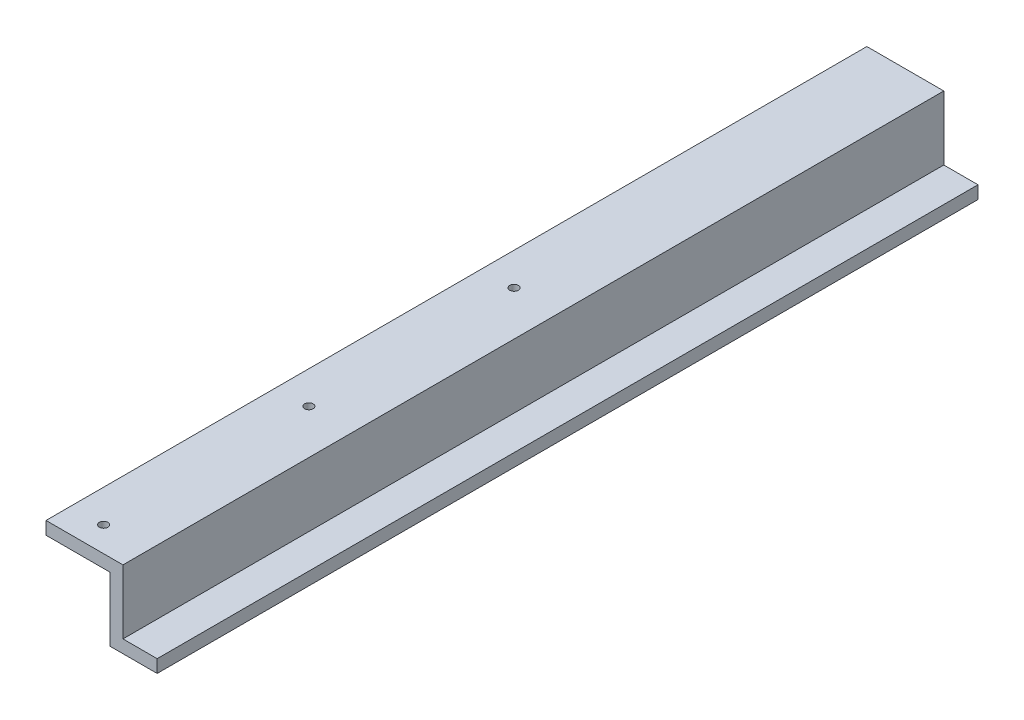
ISO-10303-21;
HEADER;
FILE_DESCRIPTION(('STEP AP214'),'2;1');
FILE_NAME('part.step','',(''),(''),'','','');
FILE_SCHEMA(('AUTOMOTIVE_DESIGN { 1 0 10303 214 1 1 1 1 }'));
ENDSEC;
DATA;
#1=APPLICATION_CONTEXT('core data for automotive mechanical design processes');
#2=APPLICATION_PROTOCOL_DEFINITION('international standard','automotive_design',2000,#1);
#3=PRODUCT_CONTEXT('',#1,'mechanical');
#4=PRODUCT('Part','Part','',(#3));
#5=PRODUCT_RELATED_PRODUCT_CATEGORY('part','',(#4));
#6=PRODUCT_DEFINITION_FORMATION('','',#4);
#7=PRODUCT_DEFINITION_CONTEXT('part definition',#1,'design');
#8=PRODUCT_DEFINITION('design','',#6,#7);
#9=PRODUCT_DEFINITION_SHAPE('','',#8);
#10=(LENGTH_UNIT() NAMED_UNIT(*) SI_UNIT(.MILLI.,.METRE.));
#11=(NAMED_UNIT(*) PLANE_ANGLE_UNIT() SI_UNIT($,.RADIAN.));
#12=(NAMED_UNIT(*) SI_UNIT($,.STERADIAN.) SOLID_ANGLE_UNIT());
#13=UNCERTAINTY_MEASURE_WITH_UNIT(LENGTH_MEASURE(1.E-05),#10,'distance_accuracy_value','');
#14=(GEOMETRIC_REPRESENTATION_CONTEXT(3) GLOBAL_UNCERTAINTY_ASSIGNED_CONTEXT((#13)) GLOBAL_UNIT_ASSIGNED_CONTEXT((#10,
#11,#12)) REPRESENTATION_CONTEXT('',''));
#15=CARTESIAN_POINT('',(0.,0.,0.));
#16=DIRECTION('',(0.,0.,1.));
#17=DIRECTION('',(1.,0.,0.));
#18=AXIS2_PLACEMENT_3D('',#15,#16,#17);
#19=CARTESIAN_POINT('',(2.38125,-9.525,152.4));
#20=DIRECTION('',(0.,-1.,0.));
#21=DIRECTION('',(0.,0.,-1.));
#22=AXIS2_PLACEMENT_3D('',#19,#20,#21);
#23=PLANE('',#22);
#24=DIRECTION('',(0.,0.,-1.));
#25=VECTOR('',#24,1.);
#26=CARTESIAN_POINT('',(15.08125,-9.525,152.4));
#27=LINE('',#26,#25);
#28=CARTESIAN_POINT('',(15.08125,-9.525,152.4));
#29=VERTEX_POINT('',#28);
#30=CARTESIAN_POINT('',(15.08125,-9.525,-152.4));
#31=VERTEX_POINT('',#30);
#32=EDGE_CURVE('E137',#29,#31,#27,.T.);
#33=ORIENTED_EDGE('',*,*,#32,.T.);
#34=DIRECTION('',(-1.,0.,0.));
#35=VECTOR('',#34,1.);
#36=CARTESIAN_POINT('',(2.38125,-9.525,-152.4));
#37=LINE('',#36,#35);
#38=CARTESIAN_POINT('',(2.38125,-9.525,-152.4));
#39=VERTEX_POINT('',#38);
#40=EDGE_CURVE('E131',#31,#39,#37,.T.);
#41=ORIENTED_EDGE('',*,*,#40,.T.);
#42=DIRECTION('',(0.,0.,-1.));
#43=VECTOR('',#42,1.);
#44=CARTESIAN_POINT('',(2.38125,-9.525,152.4));
#45=LINE('',#44,#43);
#46=CARTESIAN_POINT('',(2.38125,-9.525,152.4));
#47=VERTEX_POINT('',#46);
#48=EDGE_CURVE('E12',#47,#39,#45,.T.);
#49=ORIENTED_EDGE('',*,*,#48,.F.);
#50=DIRECTION('',(-1.,0.,0.));
#51=VECTOR('',#50,1.);
#52=CARTESIAN_POINT('',(2.38125,-9.525,152.4));
#53=LINE('',#52,#51);
#54=EDGE_CURVE('E162',#29,#47,#53,.T.);
#55=ORIENTED_EDGE('',*,*,#54,.F.);
#56=EDGE_LOOP('',(#33,#41,#49,#55));
#57=FACE_BOUND('',#56,.T.);
#58=ADVANCED_FACE('F55',(#57),#23,.F.);
#59=CARTESIAN_POINT('',(2.38125,-9.525,152.4));
#60=DIRECTION('',(-1.,0.,0.));
#61=DIRECTION('',(0.,0.,1.));
#62=AXIS2_PLACEMENT_3D('',#59,#60,#61);
#63=PLANE('',#62);
#64=ORIENTED_EDGE('',*,*,#48,.T.);
#65=DIRECTION('',(0.,1.,0.));
#66=VECTOR('',#65,1.);
#67=CARTESIAN_POINT('',(2.38125,-9.525,-152.4));
#68=LINE('',#67,#66);
#69=CARTESIAN_POINT('',(2.38125,14.2875,-152.4));
#70=VERTEX_POINT('',#69);
#71=EDGE_CURVE('E121',#39,#70,#68,.T.);
#72=ORIENTED_EDGE('',*,*,#71,.T.);
#73=DIRECTION('',(0.,0.,-1.));
#74=VECTOR('',#73,1.);
#75=CARTESIAN_POINT('',(2.38125,14.2875,152.4));
#76=LINE('',#75,#74);
#77=CARTESIAN_POINT('',(2.38125,14.2875,152.4));
#78=VERTEX_POINT('',#77);
#79=EDGE_CURVE('E62',#78,#70,#76,.T.);
#80=ORIENTED_EDGE('',*,*,#79,.F.);
#81=DIRECTION('',(0.,1.,0.));
#82=VECTOR('',#81,1.);
#83=CARTESIAN_POINT('',(2.38125,-9.525,152.4));
#84=LINE('',#83,#82);
#85=EDGE_CURVE('E122',#47,#78,#84,.T.);
#86=ORIENTED_EDGE('',*,*,#85,.F.);
#87=EDGE_LOOP('',(#64,#72,#80,#86));
#88=FACE_BOUND('',#87,.T.);
#89=ADVANCED_FACE('F119',(#88),#63,.F.);
#90=CARTESIAN_POINT('',(2.38125,14.2875,152.4));
#91=DIRECTION('',(0.,-1.,0.));
#92=DIRECTION('',(0.,0.,-1.));
#93=AXIS2_PLACEMENT_3D('',#90,#91,#92);
#94=PLANE('',#93);
#95=CARTESIAN_POINT('',(-14.0958028103765,14.2875,143.094207794197));
#96=DIRECTION('',(0.,-1.,0.));
#97=DIRECTION('',(0.,0.,-1.));
#98=AXIS2_PLACEMENT_3D('',#95,#96,#97);
#99=CIRCLE('',#98,1.5875);
#100=CARTESIAN_POINT('',(-14.0958028103765,14.2875,141.506707794197));
#101=VERTEX_POINT('',#100);
#102=EDGE_CURVE('E138',#101,#101,#99,.T.);
#103=ORIENTED_EDGE('',*,*,#102,.T.);
#104=EDGE_LOOP('',(#103));
#105=FACE_BOUND('',#104,.T.);
#106=CARTESIAN_POINT('',(-14.0958028103765,14.2875,66.8942077941967));
#107=DIRECTION('',(0.,-1.,0.));
#108=DIRECTION('',(0.,0.,-1.));
#109=AXIS2_PLACEMENT_3D('',#106,#107,#108);
#110=CIRCLE('',#109,1.5875);
#111=CARTESIAN_POINT('',(-14.0958028103765,14.2875,65.3067077941967));
#112=VERTEX_POINT('',#111);
#113=EDGE_CURVE('E361',#112,#112,#110,.T.);
#114=ORIENTED_EDGE('',*,*,#113,.T.);
#115=EDGE_LOOP('',(#114));
#116=FACE_BOUND('',#115,.T.);
#117=CARTESIAN_POINT('',(-14.0958028103765,14.2875,-9.30579220580333));
#118=DIRECTION('',(0.,-1.,0.));
#119=DIRECTION('',(0.,0.,-1.));
#120=AXIS2_PLACEMENT_3D('',#117,#118,#119);
#121=CIRCLE('',#120,1.5875);
#122=CARTESIAN_POINT('',(-14.0958028103765,14.2875,-10.8932922058033));
#123=VERTEX_POINT('',#122);
#124=EDGE_CURVE('E144',#123,#123,#121,.T.);
#125=ORIENTED_EDGE('',*,*,#124,.T.);
#126=EDGE_LOOP('',(#125));
#127=FACE_BOUND('',#126,.T.);
#128=ORIENTED_EDGE('',*,*,#79,.T.);
#129=DIRECTION('',(-1.,0.,0.));
#130=VECTOR('',#129,1.);
#131=CARTESIAN_POINT('',(2.38125,14.2875,-152.4));
#132=LINE('',#131,#130);
#133=CARTESIAN_POINT('',(-26.19375,14.2875,-152.4));
#134=VERTEX_POINT('',#133);
#135=EDGE_CURVE('E135',#70,#134,#132,.T.);
#136=ORIENTED_EDGE('',*,*,#135,.T.);
#137=DIRECTION('',(0.,0.,-1.));
#138=VECTOR('',#137,1.);
#139=CARTESIAN_POINT('',(-26.19375,14.2875,152.4));
#140=LINE('',#139,#138);
#141=CARTESIAN_POINT('',(-26.19375,14.2875,152.4));
#142=VERTEX_POINT('',#141);
#143=EDGE_CURVE('E184',#142,#134,#140,.T.);
#144=ORIENTED_EDGE('',*,*,#143,.F.);
#145=DIRECTION('',(-1.,0.,0.));
#146=VECTOR('',#145,1.);
#147=CARTESIAN_POINT('',(2.38125,14.2875,152.4));
#148=LINE('',#147,#146);
#149=EDGE_CURVE('E165',#78,#142,#148,.T.);
#150=ORIENTED_EDGE('',*,*,#149,.F.);
#151=EDGE_LOOP('',(#128,#136,#144,#150));
#152=FACE_BOUND('',#151,.T.);
#153=ADVANCED_FACE('F187',(#105,#116,#127,#152),#94,.F.);
#154=CARTESIAN_POINT('',(-26.19375,14.2875,152.4));
#155=DIRECTION('',(1.,0.,0.));
#156=DIRECTION('',(0.,0.,-1.));
#157=AXIS2_PLACEMENT_3D('',#154,#155,#156);
#158=PLANE('',#157);
#159=ORIENTED_EDGE('',*,*,#143,.T.);
#160=DIRECTION('',(0.,-1.,0.));
#161=VECTOR('',#160,1.);
#162=CARTESIAN_POINT('',(-26.19375,14.2875,-152.4));
#163=LINE('',#162,#161);
#164=CARTESIAN_POINT('',(-26.19375,9.525,-152.4));
#165=VERTEX_POINT('',#164);
#166=EDGE_CURVE('E148',#134,#165,#163,.T.);
#167=ORIENTED_EDGE('',*,*,#166,.T.);
#168=DIRECTION('',(0.,0.,-1.));
#169=VECTOR('',#168,1.);
#170=CARTESIAN_POINT('',(-26.19375,9.525,152.4));
#171=LINE('',#170,#169);
#172=CARTESIAN_POINT('',(-26.19375,9.525,152.4));
#173=VERTEX_POINT('',#172);
#174=EDGE_CURVE('E182',#173,#165,#171,.T.);
#175=ORIENTED_EDGE('',*,*,#174,.F.);
#176=DIRECTION('',(0.,-1.,0.));
#177=VECTOR('',#176,1.);
#178=CARTESIAN_POINT('',(-26.19375,14.2875,152.4));
#179=LINE('',#178,#177);
#180=EDGE_CURVE('E167',#142,#173,#179,.T.);
#181=ORIENTED_EDGE('',*,*,#180,.F.);
#182=EDGE_LOOP('',(#159,#167,#175,#181));
#183=FACE_BOUND('',#182,.T.);
#184=ADVANCED_FACE('F195',(#183),#158,.F.);
#185=CARTESIAN_POINT('',(-2.38125,9.525,152.4));
#186=DIRECTION('',(0.,1.,0.));
#187=DIRECTION('',(0.,0.,1.));
#188=AXIS2_PLACEMENT_3D('',#185,#186,#187);
#189=PLANE('',#188);
#190=CARTESIAN_POINT('',(-14.0958028103765,9.525,143.094207794197));
#191=DIRECTION('',(0.,-1.,0.));
#192=DIRECTION('',(0.,0.,-1.));
#193=AXIS2_PLACEMENT_3D('',#190,#191,#192);
#194=CIRCLE('',#193,1.5875);
#195=CARTESIAN_POINT('',(-14.0958028103765,9.525,141.506707794197));
#196=VERTEX_POINT('',#195);
#197=EDGE_CURVE('E141',#196,#196,#194,.T.);
#198=ORIENTED_EDGE('',*,*,#197,.F.);
#199=EDGE_LOOP('',(#198));
#200=FACE_BOUND('',#199,.T.);
#201=CARTESIAN_POINT('',(-14.0958028103765,9.525,66.8942077941967));
#202=DIRECTION('',(0.,-1.,0.));
#203=DIRECTION('',(0.,0.,-1.));
#204=AXIS2_PLACEMENT_3D('',#201,#202,#203);
#205=CIRCLE('',#204,1.5875);
#206=CARTESIAN_POINT('',(-14.0958028103765,9.525,65.3067077941967));
#207=VERTEX_POINT('',#206);
#208=EDGE_CURVE('E358',#207,#207,#205,.T.);
#209=ORIENTED_EDGE('',*,*,#208,.F.);
#210=EDGE_LOOP('',(#209));
#211=FACE_BOUND('',#210,.T.);
#212=CARTESIAN_POINT('',(-14.0958028103765,9.525,-9.30579220580333));
#213=DIRECTION('',(0.,-1.,0.));
#214=DIRECTION('',(0.,0.,-1.));
#215=AXIS2_PLACEMENT_3D('',#212,#213,#214);
#216=CIRCLE('',#215,1.5875);
#217=CARTESIAN_POINT('',(-14.0958028103765,9.525,-10.8932922058033));
#218=VERTEX_POINT('',#217);
#219=EDGE_CURVE('E365',#218,#218,#216,.T.);
#220=ORIENTED_EDGE('',*,*,#219,.F.);
#221=EDGE_LOOP('',(#220));
#222=FACE_BOUND('',#221,.T.);
#223=ORIENTED_EDGE('',*,*,#174,.T.);
#224=DIRECTION('',(1.,0.,0.));
#225=VECTOR('',#224,1.);
#226=CARTESIAN_POINT('',(-2.38125,9.525,-152.4));
#227=LINE('',#226,#225);
#228=CARTESIAN_POINT('',(-2.38125,9.525,-152.4));
#229=VERTEX_POINT('',#228);
#230=EDGE_CURVE('E151',#165,#229,#227,.T.);
#231=ORIENTED_EDGE('',*,*,#230,.T.);
#232=DIRECTION('',(0.,0.,-1.));
#233=VECTOR('',#232,1.);
#234=CARTESIAN_POINT('',(-2.38125,9.525,152.4));
#235=LINE('',#234,#233);
#236=CARTESIAN_POINT('',(-2.38125,9.525,152.4));
#237=VERTEX_POINT('',#236);
#238=EDGE_CURVE('E180',#237,#229,#235,.T.);
#239=ORIENTED_EDGE('',*,*,#238,.F.);
#240=DIRECTION('',(1.,0.,0.));
#241=VECTOR('',#240,1.);
#242=CARTESIAN_POINT('',(-2.38125,9.525,152.4));
#243=LINE('',#242,#241);
#244=EDGE_CURVE('E169',#173,#237,#243,.T.);
#245=ORIENTED_EDGE('',*,*,#244,.F.);
#246=EDGE_LOOP('',(#223,#231,#239,#245));
#247=FACE_BOUND('',#246,.T.);
#248=ADVANCED_FACE('F198',(#200,#211,#222,#247),#189,.F.);
#249=CARTESIAN_POINT('',(-2.38125,-14.2875,152.4));
#250=DIRECTION('',(1.,0.,0.));
#251=DIRECTION('',(0.,0.,-1.));
#252=AXIS2_PLACEMENT_3D('',#249,#250,#251);
#253=PLANE('',#252);
#254=ORIENTED_EDGE('',*,*,#238,.T.);
#255=DIRECTION('',(0.,-1.,0.));
#256=VECTOR('',#255,1.);
#257=CARTESIAN_POINT('',(-2.38125,-14.2875,-152.4));
#258=LINE('',#257,#256);
#259=CARTESIAN_POINT('',(-2.38125,-14.2875,-152.4));
#260=VERTEX_POINT('',#259);
#261=EDGE_CURVE('E154',#229,#260,#258,.T.);
#262=ORIENTED_EDGE('',*,*,#261,.T.);
#263=DIRECTION('',(0.,0.,-1.));
#264=VECTOR('',#263,1.);
#265=CARTESIAN_POINT('',(-2.38125,-14.2875,152.4));
#266=LINE('',#265,#264);
#267=CARTESIAN_POINT('',(-2.38125,-14.2875,152.4));
#268=VERTEX_POINT('',#267);
#269=EDGE_CURVE('E178',#268,#260,#266,.T.);
#270=ORIENTED_EDGE('',*,*,#269,.F.);
#271=DIRECTION('',(0.,-1.,0.));
#272=VECTOR('',#271,1.);
#273=CARTESIAN_POINT('',(-2.38125,-14.2875,152.4));
#274=LINE('',#273,#272);
#275=EDGE_CURVE('E171',#237,#268,#274,.T.);
#276=ORIENTED_EDGE('',*,*,#275,.F.);
#277=EDGE_LOOP('',(#254,#262,#270,#276));
#278=FACE_BOUND('',#277,.T.);
#279=ADVANCED_FACE('F203',(#278),#253,.F.);
#280=CARTESIAN_POINT('',(-2.38125,-14.2875,152.4));
#281=DIRECTION('',(0.,1.,0.));
#282=DIRECTION('',(0.,0.,1.));
#283=AXIS2_PLACEMENT_3D('',#280,#281,#282);
#284=PLANE('',#283);
#285=ORIENTED_EDGE('',*,*,#269,.T.);
#286=DIRECTION('',(1.,0.,0.));
#287=VECTOR('',#286,1.);
#288=CARTESIAN_POINT('',(-2.38125,-14.2875,-152.4));
#289=LINE('',#288,#287);
#290=CARTESIAN_POINT('',(15.08125,-14.2875,-152.4));
#291=VERTEX_POINT('',#290);
#292=EDGE_CURVE('E157',#260,#291,#289,.T.);
#293=ORIENTED_EDGE('',*,*,#292,.T.);
#294=DIRECTION('',(0.,0.,-1.));
#295=VECTOR('',#294,1.);
#296=CARTESIAN_POINT('',(15.08125,-14.2875,152.4));
#297=LINE('',#296,#295);
#298=CARTESIAN_POINT('',(15.08125,-14.2875,152.4));
#299=VERTEX_POINT('',#298);
#300=EDGE_CURVE('E176',#299,#291,#297,.T.);
#301=ORIENTED_EDGE('',*,*,#300,.F.);
#302=DIRECTION('',(1.,0.,0.));
#303=VECTOR('',#302,1.);
#304=CARTESIAN_POINT('',(-2.38125,-14.2875,152.4));
#305=LINE('',#304,#303);
#306=EDGE_CURVE('E74',#268,#299,#305,.T.);
#307=ORIENTED_EDGE('',*,*,#306,.F.);
#308=EDGE_LOOP('',(#285,#293,#301,#307));
#309=FACE_BOUND('',#308,.T.);
#310=ADVANCED_FACE('F206',(#309),#284,.F.);
#311=CARTESIAN_POINT('',(15.08125,-9.525,152.4));
#312=DIRECTION('',(-1.,0.,0.));
#313=DIRECTION('',(0.,0.,1.));
#314=AXIS2_PLACEMENT_3D('',#311,#312,#313);
#315=PLANE('',#314);
#316=ORIENTED_EDGE('',*,*,#300,.T.);
#317=DIRECTION('',(0.,1.,0.));
#318=VECTOR('',#317,1.);
#319=CARTESIAN_POINT('',(15.08125,-9.525,-152.4));
#320=LINE('',#319,#318);
#321=EDGE_CURVE('E160',#291,#31,#320,.T.);
#322=ORIENTED_EDGE('',*,*,#321,.T.);
#323=ORIENTED_EDGE('',*,*,#32,.F.);
#324=DIRECTION('',(0.,1.,0.));
#325=VECTOR('',#324,1.);
#326=CARTESIAN_POINT('',(15.08125,-9.525,152.4));
#327=LINE('',#326,#325);
#328=EDGE_CURVE('E69',#299,#29,#327,.T.);
#329=ORIENTED_EDGE('',*,*,#328,.F.);
#330=EDGE_LOOP('',(#316,#322,#323,#329));
#331=FACE_BOUND('',#330,.T.);
#332=ADVANCED_FACE('F208',(#331),#315,.F.);
#333=CARTESIAN_POINT('',(0.,0.,152.4));
#334=DIRECTION('',(0.,0.,-1.));
#335=DIRECTION('',(-1.,0.,0.));
#336=AXIS2_PLACEMENT_3D('',#333,#334,#335);
#337=PLANE('',#336);
#338=ORIENTED_EDGE('',*,*,#54,.T.);
#339=ORIENTED_EDGE('',*,*,#85,.T.);
#340=ORIENTED_EDGE('',*,*,#149,.T.);
#341=ORIENTED_EDGE('',*,*,#180,.T.);
#342=ORIENTED_EDGE('',*,*,#244,.T.);
#343=ORIENTED_EDGE('',*,*,#275,.T.);
#344=ORIENTED_EDGE('',*,*,#306,.T.);
#345=ORIENTED_EDGE('',*,*,#328,.T.);
#346=EDGE_LOOP('',(#338,#339,#340,#341,#342,#343,#344,#345));
#347=FACE_BOUND('',#346,.T.);
#348=ADVANCED_FACE('F190',(#347),#337,.F.);
#349=CARTESIAN_POINT('',(0.,0.,-152.4));
#350=DIRECTION('',(0.,0.,-1.));
#351=DIRECTION('',(-1.,0.,0.));
#352=AXIS2_PLACEMENT_3D('',#349,#350,#351);
#353=PLANE('',#352);
#354=ORIENTED_EDGE('',*,*,#40,.F.);
#355=ORIENTED_EDGE('',*,*,#321,.F.);
#356=ORIENTED_EDGE('',*,*,#292,.F.);
#357=ORIENTED_EDGE('',*,*,#261,.F.);
#358=ORIENTED_EDGE('',*,*,#230,.F.);
#359=ORIENTED_EDGE('',*,*,#166,.F.);
#360=ORIENTED_EDGE('',*,*,#135,.F.);
#361=ORIENTED_EDGE('',*,*,#71,.F.);
#362=EDGE_LOOP('',(#354,#355,#356,#357,#358,#359,#360,#361));
#363=FACE_BOUND('',#362,.T.);
#364=ADVANCED_FACE('F129',(#363),#353,.T.);
#365=CARTESIAN_POINT('',(-14.0958028103765,14.2875,-9.30579220580333));
#366=DIRECTION('',(0.,-1.,0.));
#367=DIRECTION('',(0.,0.,-1.));
#368=AXIS2_PLACEMENT_3D('',#365,#366,#367);
#369=CYLINDRICAL_SURFACE('',#368,1.5875);
#370=CARTESIAN_POINT('',(-14.0958028103765,14.2875,-10.8932922058033));
#371=CARTESIAN_POINT('',(-14.0958028103765,14.237890625,-10.8932922058033));
#372=CARTESIAN_POINT('',(-14.0958028103765,14.18828125,-10.8932922058033));
#373=CARTESIAN_POINT('',(-14.0958028103765,14.0890625,-10.8932922058033));
#374=CARTESIAN_POINT('',(-14.0958028103765,14.039453125,-10.8932922058033));
#375=CARTESIAN_POINT('',(-14.0958028103765,13.940234375,-10.8932922058033));
#376=CARTESIAN_POINT('',(-14.0958028103765,13.890625,-10.8932922058033));
#377=CARTESIAN_POINT('',(-14.0958028103765,13.79140625,-10.8932922058033));
#378=CARTESIAN_POINT('',(-14.0958028103765,13.741796875,-10.8932922058033));
#379=CARTESIAN_POINT('',(-14.0958028103765,13.642578125,-10.8932922058033));
#380=CARTESIAN_POINT('',(-14.0958028103765,13.59296875,-10.8932922058033));
#381=CARTESIAN_POINT('',(-14.0958028103765,13.49375,-10.8932922058033));
#382=CARTESIAN_POINT('',(-14.0958028103765,13.444140625,-10.8932922058033));
#383=CARTESIAN_POINT('',(-14.0958028103765,13.344921875,-10.8932922058033));
#384=CARTESIAN_POINT('',(-14.0958028103765,13.2953125,-10.8932922058033));
#385=CARTESIAN_POINT('',(-14.0958028103765,13.19609375,-10.8932922058033));
#386=CARTESIAN_POINT('',(-14.0958028103765,13.146484375,-10.8932922058033));
#387=CARTESIAN_POINT('',(-14.0958028103765,13.047265625,-10.8932922058033));
#388=CARTESIAN_POINT('',(-14.0958028103765,12.99765625,-10.8932922058033));
#389=CARTESIAN_POINT('',(-14.0958028103765,12.8984375,-10.8932922058033));
#390=CARTESIAN_POINT('',(-14.0958028103765,12.848828125,-10.8932922058033));
#391=CARTESIAN_POINT('',(-14.0958028103765,12.749609375,-10.8932922058033));
#392=CARTESIAN_POINT('',(-14.0958028103765,12.7,-10.8932922058033));
#393=CARTESIAN_POINT('',(-14.0958028103765,12.60078125,-10.8932922058033));
#394=CARTESIAN_POINT('',(-14.0958028103765,12.551171875,-10.8932922058033));
#395=CARTESIAN_POINT('',(-14.0958028103765,12.451953125,-10.8932922058033));
#396=CARTESIAN_POINT('',(-14.0958028103765,12.40234375,-10.8932922058033));
#397=CARTESIAN_POINT('',(-14.0958028103765,12.303125,-10.8932922058033));
#398=CARTESIAN_POINT('',(-14.0958028103765,12.253515625,-10.8932922058033));
#399=CARTESIAN_POINT('',(-14.0958028103765,12.154296875,-10.8932922058033));
#400=CARTESIAN_POINT('',(-14.0958028103765,12.1046875,-10.8932922058033));
#401=CARTESIAN_POINT('',(-14.0958028103765,12.00546875,-10.8932922058033));
#402=CARTESIAN_POINT('',(-14.0958028103765,11.955859375,-10.8932922058033));
#403=CARTESIAN_POINT('',(-14.0958028103765,11.856640625,-10.8932922058033));
#404=CARTESIAN_POINT('',(-14.0958028103765,11.80703125,-10.8932922058033));
#405=CARTESIAN_POINT('',(-14.0958028103765,11.7078125,-10.8932922058033));
#406=CARTESIAN_POINT('',(-14.0958028103765,11.658203125,-10.8932922058033));
#407=CARTESIAN_POINT('',(-14.0958028103765,11.558984375,-10.8932922058033));
#408=CARTESIAN_POINT('',(-14.0958028103765,11.509375,-10.8932922058033));
#409=CARTESIAN_POINT('',(-14.0958028103765,11.41015625,-10.8932922058033));
#410=CARTESIAN_POINT('',(-14.0958028103765,11.360546875,-10.8932922058033));
#411=CARTESIAN_POINT('',(-14.0958028103765,11.261328125,-10.8932922058033));
#412=CARTESIAN_POINT('',(-14.0958028103765,11.21171875,-10.8932922058033));
#413=CARTESIAN_POINT('',(-14.0958028103765,11.1125,-10.8932922058033));
#414=CARTESIAN_POINT('',(-14.0958028103765,11.062890625,-10.8932922058033));
#415=CARTESIAN_POINT('',(-14.0958028103765,10.963671875,-10.8932922058033));
#416=CARTESIAN_POINT('',(-14.0958028103765,10.9140625,-10.8932922058033));
#417=CARTESIAN_POINT('',(-14.0958028103765,10.81484375,-10.8932922058033));
#418=CARTESIAN_POINT('',(-14.0958028103765,10.765234375,-10.8932922058033));
#419=CARTESIAN_POINT('',(-14.0958028103765,10.666015625,-10.8932922058033));
#420=CARTESIAN_POINT('',(-14.0958028103765,10.61640625,-10.8932922058033));
#421=CARTESIAN_POINT('',(-14.0958028103765,10.5171875,-10.8932922058033));
#422=CARTESIAN_POINT('',(-14.0958028103765,10.467578125,-10.8932922058033));
#423=CARTESIAN_POINT('',(-14.0958028103765,10.368359375,-10.8932922058033));
#424=CARTESIAN_POINT('',(-14.0958028103765,10.31875,-10.8932922058033));
#425=CARTESIAN_POINT('',(-14.0958028103765,10.21953125,-10.8932922058033));
#426=CARTESIAN_POINT('',(-14.0958028103765,10.169921875,-10.8932922058033));
#427=CARTESIAN_POINT('',(-14.0958028103765,10.070703125,-10.8932922058033));
#428=CARTESIAN_POINT('',(-14.0958028103765,10.02109375,-10.8932922058033));
#429=CARTESIAN_POINT('',(-14.0958028103765,9.921875,-10.8932922058033));
#430=CARTESIAN_POINT('',(-14.0958028103765,9.872265625,-10.8932922058033));
#431=CARTESIAN_POINT('',(-14.0958028103765,9.773046875,-10.8932922058033));
#432=CARTESIAN_POINT('',(-14.0958028103765,9.7234375,-10.8932922058033));
#433=CARTESIAN_POINT('',(-14.0958028103765,9.62421875,-10.8932922058033));
#434=CARTESIAN_POINT('',(-14.0958028103765,9.574609375,-10.8932922058033));
#435=CARTESIAN_POINT('',(-14.0958028103765,9.525,-10.8932922058033));
#436=B_SPLINE_CURVE_WITH_KNOTS('',3,(#370,#371,#372,#373,#374,#375,#376,#377,#378,#379,#380,
#381,#382,#383,#384,#385,#386,#387,#388,#389,#390,#391,#392,#393,#394,#395,#396,#397,#398,#399,
#400,#401,#402,#403,#404,#405,#406,#407,#408,#409,#410,#411,#412,#413,#414,#415,#416,#417,#418,
#419,#420,#421,#422,#423,#424,#425,#426,#427,#428,#429,#430,#431,#432,#433,#434,#435),
.UNSPECIFIED.,.F.,.F.,(4,2,2,2,2,2,2,2,2,2,2,2,2,2,2,2,2,2,2,2,2,2,2,2,2,2,2,2,2,2,2,2,4),(0.,
0.148828124999998,0.297656249999998,0.446484374999999,0.595312499999999,0.744140624999999,
0.892968749999999,1.041796875,1.190625,1.339453125,1.48828125,1.637109375,1.7859375,1.934765625,
2.08359375,2.232421875,2.38125,2.530078125,2.67890625,2.827734375,2.9765625,3.125390625,
3.27421875,3.423046875,3.571875,3.720703125,3.86953125,4.018359375,4.1671875,4.316015625,
4.46484375,4.613671875,4.7625),.UNSPECIFIED.);
#437=EDGE_CURVE('BSEAM266',#123,#218,#436,.T.);
#438=ORIENTED_EDGE('',*,*,#124,.F.);
#439=ORIENTED_EDGE('',*,*,#219,.T.);
#440=ORIENTED_EDGE('',*,*,#437,.T.);
#441=ORIENTED_EDGE('',*,*,#437,.F.);
#442=EDGE_LOOP('',(#438,#440,#439,#441));
#443=FACE_BOUND('',#442,.T.);
#444=ADVANCED_FACE('F266',(#443),#369,.F.);
#445=CARTESIAN_POINT('',(-14.0958028103765,14.2875,66.8942077941967));
#446=DIRECTION('',(0.,-1.,0.));
#447=DIRECTION('',(0.,0.,-1.));
#448=AXIS2_PLACEMENT_3D('',#445,#446,#447);
#449=CYLINDRICAL_SURFACE('',#448,1.5875);
#450=CARTESIAN_POINT('',(-14.0958028103765,14.2875,65.3067077941967));
#451=CARTESIAN_POINT('',(-14.0958028103765,14.237890625,65.3067077941967));
#452=CARTESIAN_POINT('',(-14.0958028103765,14.18828125,65.3067077941967));
#453=CARTESIAN_POINT('',(-14.0958028103765,14.0890625,65.3067077941967));
#454=CARTESIAN_POINT('',(-14.0958028103765,14.039453125,65.3067077941967));
#455=CARTESIAN_POINT('',(-14.0958028103765,13.940234375,65.3067077941967));
#456=CARTESIAN_POINT('',(-14.0958028103765,13.890625,65.3067077941967));
#457=CARTESIAN_POINT('',(-14.0958028103765,13.79140625,65.3067077941967));
#458=CARTESIAN_POINT('',(-14.0958028103765,13.741796875,65.3067077941967));
#459=CARTESIAN_POINT('',(-14.0958028103765,13.642578125,65.3067077941967));
#460=CARTESIAN_POINT('',(-14.0958028103765,13.59296875,65.3067077941967));
#461=CARTESIAN_POINT('',(-14.0958028103765,13.49375,65.3067077941967));
#462=CARTESIAN_POINT('',(-14.0958028103765,13.444140625,65.3067077941967));
#463=CARTESIAN_POINT('',(-14.0958028103765,13.344921875,65.3067077941967));
#464=CARTESIAN_POINT('',(-14.0958028103765,13.2953125,65.3067077941967));
#465=CARTESIAN_POINT('',(-14.0958028103765,13.19609375,65.3067077941967));
#466=CARTESIAN_POINT('',(-14.0958028103765,13.146484375,65.3067077941967));
#467=CARTESIAN_POINT('',(-14.0958028103765,13.047265625,65.3067077941967));
#468=CARTESIAN_POINT('',(-14.0958028103765,12.99765625,65.3067077941967));
#469=CARTESIAN_POINT('',(-14.0958028103765,12.8984375,65.3067077941967));
#470=CARTESIAN_POINT('',(-14.0958028103765,12.848828125,65.3067077941967));
#471=CARTESIAN_POINT('',(-14.0958028103765,12.749609375,65.3067077941967));
#472=CARTESIAN_POINT('',(-14.0958028103765,12.7,65.3067077941967));
#473=CARTESIAN_POINT('',(-14.0958028103765,12.60078125,65.3067077941967));
#474=CARTESIAN_POINT('',(-14.0958028103765,12.551171875,65.3067077941967));
#475=CARTESIAN_POINT('',(-14.0958028103765,12.451953125,65.3067077941967));
#476=CARTESIAN_POINT('',(-14.0958028103765,12.40234375,65.3067077941967));
#477=CARTESIAN_POINT('',(-14.0958028103765,12.303125,65.3067077941967));
#478=CARTESIAN_POINT('',(-14.0958028103765,12.253515625,65.3067077941967));
#479=CARTESIAN_POINT('',(-14.0958028103765,12.154296875,65.3067077941967));
#480=CARTESIAN_POINT('',(-14.0958028103765,12.1046875,65.3067077941967));
#481=CARTESIAN_POINT('',(-14.0958028103765,12.00546875,65.3067077941967));
#482=CARTESIAN_POINT('',(-14.0958028103765,11.955859375,65.3067077941967));
#483=CARTESIAN_POINT('',(-14.0958028103765,11.856640625,65.3067077941967));
#484=CARTESIAN_POINT('',(-14.0958028103765,11.80703125,65.3067077941967));
#485=CARTESIAN_POINT('',(-14.0958028103765,11.7078125,65.3067077941967));
#486=CARTESIAN_POINT('',(-14.0958028103765,11.658203125,65.3067077941967));
#487=CARTESIAN_POINT('',(-14.0958028103765,11.558984375,65.3067077941967));
#488=CARTESIAN_POINT('',(-14.0958028103765,11.509375,65.3067077941967));
#489=CARTESIAN_POINT('',(-14.0958028103765,11.41015625,65.3067077941967));
#490=CARTESIAN_POINT('',(-14.0958028103765,11.360546875,65.3067077941967));
#491=CARTESIAN_POINT('',(-14.0958028103765,11.261328125,65.3067077941967));
#492=CARTESIAN_POINT('',(-14.0958028103765,11.21171875,65.3067077941967));
#493=CARTESIAN_POINT('',(-14.0958028103765,11.1125,65.3067077941967));
#494=CARTESIAN_POINT('',(-14.0958028103765,11.062890625,65.3067077941967));
#495=CARTESIAN_POINT('',(-14.0958028103765,10.963671875,65.3067077941967));
#496=CARTESIAN_POINT('',(-14.0958028103765,10.9140625,65.3067077941967));
#497=CARTESIAN_POINT('',(-14.0958028103765,10.81484375,65.3067077941967));
#498=CARTESIAN_POINT('',(-14.0958028103765,10.765234375,65.3067077941967));
#499=CARTESIAN_POINT('',(-14.0958028103765,10.666015625,65.3067077941967));
#500=CARTESIAN_POINT('',(-14.0958028103765,10.61640625,65.3067077941967));
#501=CARTESIAN_POINT('',(-14.0958028103765,10.5171875,65.3067077941967));
#502=CARTESIAN_POINT('',(-14.0958028103765,10.467578125,65.3067077941967));
#503=CARTESIAN_POINT('',(-14.0958028103765,10.368359375,65.3067077941967));
#504=CARTESIAN_POINT('',(-14.0958028103765,10.31875,65.3067077941967));
#505=CARTESIAN_POINT('',(-14.0958028103765,10.21953125,65.3067077941967));
#506=CARTESIAN_POINT('',(-14.0958028103765,10.169921875,65.3067077941967));
#507=CARTESIAN_POINT('',(-14.0958028103765,10.070703125,65.3067077941967));
#508=CARTESIAN_POINT('',(-14.0958028103765,10.02109375,65.3067077941967));
#509=CARTESIAN_POINT('',(-14.0958028103765,9.921875,65.3067077941967));
#510=CARTESIAN_POINT('',(-14.0958028103765,9.872265625,65.3067077941967));
#511=CARTESIAN_POINT('',(-14.0958028103765,9.773046875,65.3067077941967));
#512=CARTESIAN_POINT('',(-14.0958028103765,9.7234375,65.3067077941967));
#513=CARTESIAN_POINT('',(-14.0958028103765,9.62421875,65.3067077941967));
#514=CARTESIAN_POINT('',(-14.0958028103765,9.574609375,65.3067077941967));
#515=CARTESIAN_POINT('',(-14.0958028103765,9.525,65.3067077941967));
#516=B_SPLINE_CURVE_WITH_KNOTS('',3,(#450,#451,#452,#453,#454,#455,#456,#457,#458,#459,#460,
#461,#462,#463,#464,#465,#466,#467,#468,#469,#470,#471,#472,#473,#474,#475,#476,#477,#478,#479,
#480,#481,#482,#483,#484,#485,#486,#487,#488,#489,#490,#491,#492,#493,#494,#495,#496,#497,#498,
#499,#500,#501,#502,#503,#504,#505,#506,#507,#508,#509,#510,#511,#512,#513,#514,#515),
.UNSPECIFIED.,.F.,.F.,(4,2,2,2,2,2,2,2,2,2,2,2,2,2,2,2,2,2,2,2,2,2,2,2,2,2,2,2,2,2,2,2,4),(0.,
0.148828124999998,0.297656249999998,0.446484374999999,0.595312499999999,0.744140624999999,
0.892968749999999,1.041796875,1.190625,1.339453125,1.48828125,1.637109375,1.7859375,1.934765625,
2.08359375,2.232421875,2.38125,2.530078125,2.67890625,2.827734375,2.9765625,3.125390625,
3.27421875,3.423046875,3.571875,3.720703125,3.86953125,4.018359375,4.1671875,4.316015625,
4.46484375,4.613671875,4.7625),.UNSPECIFIED.);
#517=EDGE_CURVE('BSEAM291',#112,#207,#516,.T.);
#518=ORIENTED_EDGE('',*,*,#113,.F.);
#519=ORIENTED_EDGE('',*,*,#208,.T.);
#520=ORIENTED_EDGE('',*,*,#517,.T.);
#521=ORIENTED_EDGE('',*,*,#517,.F.);
#522=EDGE_LOOP('',(#518,#520,#519,#521));
#523=FACE_BOUND('',#522,.T.);
#524=ADVANCED_FACE('F291',(#523),#449,.F.);
#525=CARTESIAN_POINT('',(-14.0958028103765,14.2875,143.094207794197));
#526=DIRECTION('',(0.,-1.,0.));
#527=DIRECTION('',(0.,0.,-1.));
#528=AXIS2_PLACEMENT_3D('',#525,#526,#527);
#529=CYLINDRICAL_SURFACE('',#528,1.5875);
#530=CARTESIAN_POINT('',(-14.0958028103765,14.2875,141.506707794197));
#531=CARTESIAN_POINT('',(-14.0958028103765,14.237890625,141.506707794197));
#532=CARTESIAN_POINT('',(-14.0958028103765,14.18828125,141.506707794197));
#533=CARTESIAN_POINT('',(-14.0958028103765,14.0890625,141.506707794197));
#534=CARTESIAN_POINT('',(-14.0958028103765,14.039453125,141.506707794197));
#535=CARTESIAN_POINT('',(-14.0958028103765,13.940234375,141.506707794197));
#536=CARTESIAN_POINT('',(-14.0958028103765,13.890625,141.506707794197));
#537=CARTESIAN_POINT('',(-14.0958028103765,13.79140625,141.506707794197));
#538=CARTESIAN_POINT('',(-14.0958028103765,13.741796875,141.506707794197));
#539=CARTESIAN_POINT('',(-14.0958028103765,13.642578125,141.506707794197));
#540=CARTESIAN_POINT('',(-14.0958028103765,13.59296875,141.506707794197));
#541=CARTESIAN_POINT('',(-14.0958028103765,13.49375,141.506707794197));
#542=CARTESIAN_POINT('',(-14.0958028103765,13.444140625,141.506707794197));
#543=CARTESIAN_POINT('',(-14.0958028103765,13.344921875,141.506707794197));
#544=CARTESIAN_POINT('',(-14.0958028103765,13.2953125,141.506707794197));
#545=CARTESIAN_POINT('',(-14.0958028103765,13.19609375,141.506707794197));
#546=CARTESIAN_POINT('',(-14.0958028103765,13.146484375,141.506707794197));
#547=CARTESIAN_POINT('',(-14.0958028103765,13.047265625,141.506707794197));
#548=CARTESIAN_POINT('',(-14.0958028103765,12.99765625,141.506707794197));
#549=CARTESIAN_POINT('',(-14.0958028103765,12.8984375,141.506707794197));
#550=CARTESIAN_POINT('',(-14.0958028103765,12.848828125,141.506707794197));
#551=CARTESIAN_POINT('',(-14.0958028103765,12.749609375,141.506707794197));
#552=CARTESIAN_POINT('',(-14.0958028103765,12.7,141.506707794197));
#553=CARTESIAN_POINT('',(-14.0958028103765,12.60078125,141.506707794197));
#554=CARTESIAN_POINT('',(-14.0958028103765,12.551171875,141.506707794197));
#555=CARTESIAN_POINT('',(-14.0958028103765,12.451953125,141.506707794197));
#556=CARTESIAN_POINT('',(-14.0958028103765,12.40234375,141.506707794197));
#557=CARTESIAN_POINT('',(-14.0958028103765,12.303125,141.506707794197));
#558=CARTESIAN_POINT('',(-14.0958028103765,12.253515625,141.506707794197));
#559=CARTESIAN_POINT('',(-14.0958028103765,12.154296875,141.506707794197));
#560=CARTESIAN_POINT('',(-14.0958028103765,12.1046875,141.506707794197));
#561=CARTESIAN_POINT('',(-14.0958028103765,12.00546875,141.506707794197));
#562=CARTESIAN_POINT('',(-14.0958028103765,11.955859375,141.506707794197));
#563=CARTESIAN_POINT('',(-14.0958028103765,11.856640625,141.506707794197));
#564=CARTESIAN_POINT('',(-14.0958028103765,11.80703125,141.506707794197));
#565=CARTESIAN_POINT('',(-14.0958028103765,11.7078125,141.506707794197));
#566=CARTESIAN_POINT('',(-14.0958028103765,11.658203125,141.506707794197));
#567=CARTESIAN_POINT('',(-14.0958028103765,11.558984375,141.506707794197));
#568=CARTESIAN_POINT('',(-14.0958028103765,11.509375,141.506707794197));
#569=CARTESIAN_POINT('',(-14.0958028103765,11.41015625,141.506707794197));
#570=CARTESIAN_POINT('',(-14.0958028103765,11.360546875,141.506707794197));
#571=CARTESIAN_POINT('',(-14.0958028103765,11.261328125,141.506707794197));
#572=CARTESIAN_POINT('',(-14.0958028103765,11.21171875,141.506707794197));
#573=CARTESIAN_POINT('',(-14.0958028103765,11.1125,141.506707794197));
#574=CARTESIAN_POINT('',(-14.0958028103765,11.062890625,141.506707794197));
#575=CARTESIAN_POINT('',(-14.0958028103765,10.963671875,141.506707794197));
#576=CARTESIAN_POINT('',(-14.0958028103765,10.9140625,141.506707794197));
#577=CARTESIAN_POINT('',(-14.0958028103765,10.81484375,141.506707794197));
#578=CARTESIAN_POINT('',(-14.0958028103765,10.765234375,141.506707794197));
#579=CARTESIAN_POINT('',(-14.0958028103765,10.666015625,141.506707794197));
#580=CARTESIAN_POINT('',(-14.0958028103765,10.61640625,141.506707794197));
#581=CARTESIAN_POINT('',(-14.0958028103765,10.5171875,141.506707794197));
#582=CARTESIAN_POINT('',(-14.0958028103765,10.467578125,141.506707794197));
#583=CARTESIAN_POINT('',(-14.0958028103765,10.368359375,141.506707794197));
#584=CARTESIAN_POINT('',(-14.0958028103765,10.31875,141.506707794197));
#585=CARTESIAN_POINT('',(-14.0958028103765,10.21953125,141.506707794197));
#586=CARTESIAN_POINT('',(-14.0958028103765,10.169921875,141.506707794197));
#587=CARTESIAN_POINT('',(-14.0958028103765,10.070703125,141.506707794197));
#588=CARTESIAN_POINT('',(-14.0958028103765,10.02109375,141.506707794197));
#589=CARTESIAN_POINT('',(-14.0958028103765,9.921875,141.506707794197));
#590=CARTESIAN_POINT('',(-14.0958028103765,9.872265625,141.506707794197));
#591=CARTESIAN_POINT('',(-14.0958028103765,9.773046875,141.506707794197));
#592=CARTESIAN_POINT('',(-14.0958028103765,9.7234375,141.506707794197));
#593=CARTESIAN_POINT('',(-14.0958028103765,9.62421875,141.506707794197));
#594=CARTESIAN_POINT('',(-14.0958028103765,9.574609375,141.506707794197));
#595=CARTESIAN_POINT('',(-14.0958028103765,9.525,141.506707794197));
#596=B_SPLINE_CURVE_WITH_KNOTS('',3,(#530,#531,#532,#533,#534,#535,#536,#537,#538,#539,#540,
#541,#542,#543,#544,#545,#546,#547,#548,#549,#550,#551,#552,#553,#554,#555,#556,#557,#558,#559,
#560,#561,#562,#563,#564,#565,#566,#567,#568,#569,#570,#571,#572,#573,#574,#575,#576,#577,#578,
#579,#580,#581,#582,#583,#584,#585,#586,#587,#588,#589,#590,#591,#592,#593,#594,#595),
.UNSPECIFIED.,.F.,.F.,(4,2,2,2,2,2,2,2,2,2,2,2,2,2,2,2,2,2,2,2,2,2,2,2,2,2,2,2,2,2,2,2,4),(0.,
0.148828124999998,0.297656249999998,0.446484374999999,0.595312499999999,0.744140624999999,
0.892968749999999,1.041796875,1.190625,1.339453125,1.48828125,1.637109375,1.7859375,1.934765625,
2.08359375,2.232421875,2.38125,2.530078125,2.67890625,2.827734375,2.9765625,3.125390625,
3.27421875,3.423046875,3.571875,3.720703125,3.86953125,4.018359375,4.1671875,4.316015625,
4.46484375,4.613671875,4.7625),.UNSPECIFIED.);
#597=EDGE_CURVE('BSEAM303',#101,#196,#596,.T.);
#598=ORIENTED_EDGE('',*,*,#102,.F.);
#599=ORIENTED_EDGE('',*,*,#197,.T.);
#600=ORIENTED_EDGE('',*,*,#597,.T.);
#601=ORIENTED_EDGE('',*,*,#597,.F.);
#602=EDGE_LOOP('',(#598,#600,#599,#601));
#603=FACE_BOUND('',#602,.T.);
#604=ADVANCED_FACE('F303',(#603),#529,.F.);
#605=CLOSED_SHELL('',(#58,#89,#153,#184,#248,#279,#310,#332,#348,#364,#444,#524,#604));
#606=MANIFOLD_SOLID_BREP('B2',#605);
#607=ADVANCED_BREP_SHAPE_REPRESENTATION('',(#18,#606),#14);
#608=SHAPE_DEFINITION_REPRESENTATION(#9,#607);
ENDSEC;
END-ISO-10303-21;
